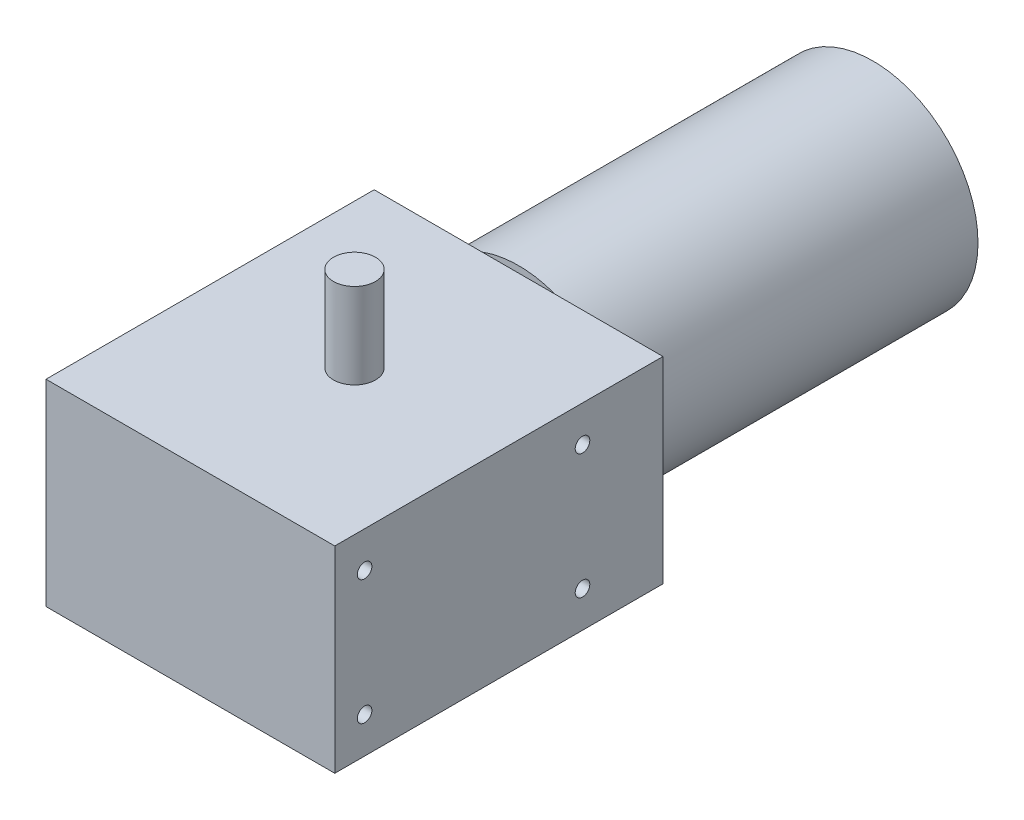
ISO-10303-21;
HEADER;
FILE_DESCRIPTION(('STEP AP214'),'2;1');
FILE_NAME('part.step','',(''),(''),'','','');
FILE_SCHEMA(('AUTOMOTIVE_DESIGN { 1 0 10303 214 1 1 1 1 }'));
ENDSEC;
DATA;
#1=APPLICATION_CONTEXT('core data for automotive mechanical design processes');
#2=APPLICATION_PROTOCOL_DEFINITION('international standard','automotive_design',2000,#1);
#3=PRODUCT_CONTEXT('',#1,'mechanical');
#4=PRODUCT('Part','Part','',(#3));
#5=PRODUCT_RELATED_PRODUCT_CATEGORY('part','',(#4));
#6=PRODUCT_DEFINITION_FORMATION('','',#4);
#7=PRODUCT_DEFINITION_CONTEXT('part definition',#1,'design');
#8=PRODUCT_DEFINITION('design','',#6,#7);
#9=PRODUCT_DEFINITION_SHAPE('','',#8);
#10=(LENGTH_UNIT() NAMED_UNIT(*) SI_UNIT(.MILLI.,.METRE.));
#11=(NAMED_UNIT(*) PLANE_ANGLE_UNIT() SI_UNIT($,.RADIAN.));
#12=(NAMED_UNIT(*) SI_UNIT($,.STERADIAN.) SOLID_ANGLE_UNIT());
#13=UNCERTAINTY_MEASURE_WITH_UNIT(LENGTH_MEASURE(1.E-05),#10,'distance_accuracy_value','');
#14=(GEOMETRIC_REPRESENTATION_CONTEXT(3) GLOBAL_UNCERTAINTY_ASSIGNED_CONTEXT((#13)) GLOBAL_UNIT_ASSIGNED_CONTEXT((#10,
#11,#12)) REPRESENTATION_CONTEXT('',''));
#15=CARTESIAN_POINT('',(0.,0.,0.));
#16=DIRECTION('',(0.,0.,1.));
#17=DIRECTION('',(1.,0.,0.));
#18=AXIS2_PLACEMENT_3D('',#15,#16,#17);
#19=CARTESIAN_POINT('',(0.,0.,-125.));
#20=DIRECTION('',(0.,0.,-1.));
#21=DIRECTION('',(-1.,0.,0.));
#22=AXIS2_PLACEMENT_3D('',#19,#20,#21);
#23=PLANE('',#22);
#24=CARTESIAN_POINT('',(0.,0.,-125.));
#25=DIRECTION('',(0.,0.,-1.));
#26=DIRECTION('',(-1.,0.,0.));
#27=AXIS2_PLACEMENT_3D('',#24,#25,#26);
#28=CIRCLE('',#27,80.);
#29=CARTESIAN_POINT('',(27.8388218141501,75.,-125.));
#30=VERTEX_POINT('',#29);
#31=CARTESIAN_POINT('',(27.8388218141501,-75.,-125.));
#32=VERTEX_POINT('',#31);
#33=EDGE_CURVE('E11',#30,#32,#28,.T.);
#34=ORIENTED_EDGE('',*,*,#33,.F.);
#35=DIRECTION('',(-1.,0.,0.));
#36=VECTOR('',#35,1.);
#37=CARTESIAN_POINT('',(-110.,75.,-125.));
#38=LINE('',#37,#36);
#39=CARTESIAN_POINT('',(110.,75.,-125.));
#40=VERTEX_POINT('',#39);
#41=EDGE_CURVE('E99',#40,#30,#38,.T.);
#42=ORIENTED_EDGE('',*,*,#41,.F.);
#43=DIRECTION('',(0.,1.,0.));
#44=VECTOR('',#43,1.);
#45=CARTESIAN_POINT('',(110.,-75.,-125.));
#46=LINE('',#45,#44);
#47=CARTESIAN_POINT('',(110.,-75.,-125.));
#48=VERTEX_POINT('',#47);
#49=EDGE_CURVE('E113',#48,#40,#46,.T.);
#50=ORIENTED_EDGE('',*,*,#49,.F.);
#51=DIRECTION('',(1.,0.,0.));
#52=VECTOR('',#51,1.);
#53=CARTESIAN_POINT('',(-110.,-75.,-125.));
#54=LINE('',#53,#52);
#55=EDGE_CURVE('E61',#32,#48,#54,.T.);
#56=ORIENTED_EDGE('',*,*,#55,.F.);
#57=EDGE_LOOP('',(#34,#42,#50,#56));
#58=FACE_BOUND('',#57,.T.);
#59=ADVANCED_FACE('F39',(#58),#23,.T.);
#60=CARTESIAN_POINT('',(110.,-75.,125.));
#61=DIRECTION('',(-1.,0.,0.));
#62=DIRECTION('',(0.,0.,1.));
#63=AXIS2_PLACEMENT_3D('',#60,#61,#62);
#64=PLANE('',#63);
#65=CARTESIAN_POINT('',(110.,-47.5,102.3));
#66=DIRECTION('',(1.,0.,0.));
#67=DIRECTION('',(0.,0.,-1.));
#68=AXIS2_PLACEMENT_3D('',#65,#66,#67);
#69=CIRCLE('',#68,5.55625);
#70=CARTESIAN_POINT('',(110.,-47.5,96.74375));
#71=VERTEX_POINT('',#70);
#72=EDGE_CURVE('E143',#71,#71,#69,.T.);
#73=ORIENTED_EDGE('',*,*,#72,.F.);
#74=EDGE_LOOP('',(#73));
#75=FACE_BOUND('',#74,.T.);
#76=CARTESIAN_POINT('',(110.,47.5,-63.7));
#77=DIRECTION('',(1.,0.,0.));
#78=DIRECTION('',(0.,0.,-1.));
#79=AXIS2_PLACEMENT_3D('',#76,#77,#78);
#80=CIRCLE('',#79,5.55625);
#81=CARTESIAN_POINT('',(110.,47.5,-69.25625));
#82=VERTEX_POINT('',#81);
#83=EDGE_CURVE('E134',#82,#82,#80,.T.);
#84=ORIENTED_EDGE('',*,*,#83,.F.);
#85=EDGE_LOOP('',(#84));
#86=FACE_BOUND('',#85,.T.);
#87=CARTESIAN_POINT('',(110.,-47.5,-63.7));
#88=DIRECTION('',(1.,0.,0.));
#89=DIRECTION('',(0.,0.,-1.));
#90=AXIS2_PLACEMENT_3D('',#87,#88,#89);
#91=CIRCLE('',#90,5.55625);
#92=CARTESIAN_POINT('',(110.,-47.5,-69.25625));
#93=VERTEX_POINT('',#92);
#94=EDGE_CURVE('E127',#93,#93,#91,.T.);
#95=ORIENTED_EDGE('',*,*,#94,.F.);
#96=EDGE_LOOP('',(#95));
#97=FACE_BOUND('',#96,.T.);
#98=CARTESIAN_POINT('',(110.,47.5,102.3));
#99=DIRECTION('',(1.,0.,0.));
#100=DIRECTION('',(0.,0.,-1.));
#101=AXIS2_PLACEMENT_3D('',#98,#99,#100);
#102=CIRCLE('',#101,5.55625);
#103=CARTESIAN_POINT('',(110.,47.5,96.74375));
#104=VERTEX_POINT('',#103);
#105=EDGE_CURVE('E142',#104,#104,#102,.T.);
#106=ORIENTED_EDGE('',*,*,#105,.F.);
#107=EDGE_LOOP('',(#106));
#108=FACE_BOUND('',#107,.T.);
#109=ORIENTED_EDGE('',*,*,#49,.T.);
#110=DIRECTION('',(0.,0.,-1.));
#111=VECTOR('',#110,1.);
#112=CARTESIAN_POINT('',(110.,75.,125.));
#113=LINE('',#112,#111);
#114=CARTESIAN_POINT('',(110.,75.,125.));
#115=VERTEX_POINT('',#114);
#116=EDGE_CURVE('E205',#115,#40,#113,.T.);
#117=ORIENTED_EDGE('',*,*,#116,.F.);
#118=DIRECTION('',(0.,1.,0.));
#119=VECTOR('',#118,1.);
#120=CARTESIAN_POINT('',(110.,-75.,125.));
#121=LINE('',#120,#119);
#122=CARTESIAN_POINT('',(110.,-75.,125.));
#123=VERTEX_POINT('',#122);
#124=EDGE_CURVE('E172',#123,#115,#121,.T.);
#125=ORIENTED_EDGE('',*,*,#124,.F.);
#126=DIRECTION('',(0.,0.,-1.));
#127=VECTOR('',#126,1.);
#128=CARTESIAN_POINT('',(110.,-75.,125.));
#129=LINE('',#128,#127);
#130=EDGE_CURVE('E186',#123,#48,#129,.T.);
#131=ORIENTED_EDGE('',*,*,#130,.T.);
#132=EDGE_LOOP('',(#109,#117,#125,#131));
#133=FACE_BOUND('',#132,.T.);
#134=ADVANCED_FACE('F41',(#75,#86,#97,#108,#133),#64,.F.);
#135=CARTESIAN_POINT('',(-110.,75.,125.));
#136=DIRECTION('',(0.,-1.,0.));
#137=DIRECTION('',(0.,0.,-1.));
#138=AXIS2_PLACEMENT_3D('',#135,#136,#137);
#139=PLANE('',#138);
#140=CARTESIAN_POINT('',(0.,75.,0.));
#141=DIRECTION('',(0.,-1.,0.));
#142=DIRECTION('',(0.,0.,-1.));
#143=AXIS2_PLACEMENT_3D('',#140,#141,#142);
#144=CIRCLE('',#143,16.);
#145=CARTESIAN_POINT('',(0.,75.,-16.));
#146=VERTEX_POINT('',#145);
#147=EDGE_CURVE('E120',#146,#146,#144,.F.);
#148=ORIENTED_EDGE('',*,*,#147,.F.);
#149=EDGE_LOOP('',(#148));
#150=FACE_BOUND('',#149,.T.);
#151=ORIENTED_EDGE('',*,*,#41,.T.);
#152=CARTESIAN_POINT('',(-27.8388218141501,75.,-125.));
#153=VERTEX_POINT('',#152);
#154=EDGE_CURVE('E92',#30,#153,#38,.T.);
#155=ORIENTED_EDGE('',*,*,#154,.T.);
#156=CARTESIAN_POINT('',(-110.,75.,-125.));
#157=VERTEX_POINT('',#156);
#158=EDGE_CURVE('E96',#153,#157,#38,.T.);
#159=ORIENTED_EDGE('',*,*,#158,.T.);
#160=DIRECTION('',(0.,0.,-1.));
#161=VECTOR('',#160,1.);
#162=CARTESIAN_POINT('',(-110.,75.,125.));
#163=LINE('',#162,#161);
#164=CARTESIAN_POINT('',(-110.,75.,125.));
#165=VERTEX_POINT('',#164);
#166=EDGE_CURVE('E203',#165,#157,#163,.T.);
#167=ORIENTED_EDGE('',*,*,#166,.F.);
#168=DIRECTION('',(-1.,0.,0.));
#169=VECTOR('',#168,1.);
#170=CARTESIAN_POINT('',(-110.,75.,125.));
#171=LINE('',#170,#169);
#172=EDGE_CURVE('E176',#115,#165,#171,.T.);
#173=ORIENTED_EDGE('',*,*,#172,.F.);
#174=ORIENTED_EDGE('',*,*,#116,.T.);
#175=EDGE_LOOP('',(#151,#155,#159,#167,#173,#174));
#176=FACE_BOUND('',#175,.T.);
#177=ADVANCED_FACE('F94',(#150,#176),#139,.F.);
#178=CARTESIAN_POINT('',(-110.,-75.,125.));
#179=DIRECTION('',(1.,0.,0.));
#180=DIRECTION('',(0.,0.,-1.));
#181=AXIS2_PLACEMENT_3D('',#178,#179,#180);
#182=PLANE('',#181);
#183=DIRECTION('',(0.,-1.,0.));
#184=VECTOR('',#183,1.);
#185=CARTESIAN_POINT('',(-110.,-75.,-125.));
#186=LINE('',#185,#184);
#187=CARTESIAN_POINT('',(-110.,-75.,-125.));
#188=VERTEX_POINT('',#187);
#189=EDGE_CURVE('E111',#157,#188,#186,.T.);
#190=ORIENTED_EDGE('',*,*,#189,.T.);
#191=DIRECTION('',(0.,0.,-1.));
#192=VECTOR('',#191,1.);
#193=CARTESIAN_POINT('',(-110.,-75.,125.));
#194=LINE('',#193,#192);
#195=CARTESIAN_POINT('',(-110.,-75.,125.));
#196=VERTEX_POINT('',#195);
#197=EDGE_CURVE('E199',#196,#188,#194,.T.);
#198=ORIENTED_EDGE('',*,*,#197,.F.);
#199=DIRECTION('',(0.,-1.,0.));
#200=VECTOR('',#199,1.);
#201=CARTESIAN_POINT('',(-110.,-75.,125.));
#202=LINE('',#201,#200);
#203=EDGE_CURVE('E180',#165,#196,#202,.T.);
#204=ORIENTED_EDGE('',*,*,#203,.F.);
#205=ORIENTED_EDGE('',*,*,#166,.T.);
#206=EDGE_LOOP('',(#190,#198,#204,#205));
#207=FACE_BOUND('',#206,.T.);
#208=ADVANCED_FACE('F218',(#207),#182,.F.);
#209=CARTESIAN_POINT('',(-110.,-75.,125.));
#210=DIRECTION('',(0.,1.,0.));
#211=DIRECTION('',(0.,0.,1.));
#212=AXIS2_PLACEMENT_3D('',#209,#210,#211);
#213=PLANE('',#212);
#214=CARTESIAN_POINT('',(0.,-75.,0.));
#215=DIRECTION('',(0.,1.,0.));
#216=DIRECTION('',(0.,0.,1.));
#217=AXIS2_PLACEMENT_3D('',#214,#215,#216);
#218=CIRCLE('',#217,16.);
#219=CARTESIAN_POINT('',(0.,-75.,16.));
#220=VERTEX_POINT('',#219);
#221=EDGE_CURVE('E43',#220,#220,#218,.F.);
#222=ORIENTED_EDGE('',*,*,#221,.F.);
#223=EDGE_LOOP('',(#222));
#224=FACE_BOUND('',#223,.T.);
#225=CARTESIAN_POINT('',(-27.8388218141501,-75.,-125.));
#226=VERTEX_POINT('',#225);
#227=EDGE_CURVE('E177',#188,#226,#54,.T.);
#228=ORIENTED_EDGE('',*,*,#227,.T.);
#229=EDGE_CURVE('E195',#226,#32,#54,.T.);
#230=ORIENTED_EDGE('',*,*,#229,.T.);
#231=ORIENTED_EDGE('',*,*,#55,.T.);
#232=ORIENTED_EDGE('',*,*,#130,.F.);
#233=DIRECTION('',(1.,0.,0.));
#234=VECTOR('',#233,1.);
#235=CARTESIAN_POINT('',(-110.,-75.,125.));
#236=LINE('',#235,#234);
#237=EDGE_CURVE('E183',#196,#123,#236,.T.);
#238=ORIENTED_EDGE('',*,*,#237,.F.);
#239=ORIENTED_EDGE('',*,*,#197,.T.);
#240=EDGE_LOOP('',(#228,#230,#231,#232,#238,#239));
#241=FACE_BOUND('',#240,.T.);
#242=ADVANCED_FACE('F214',(#224,#241),#213,.F.);
#243=CARTESIAN_POINT('',(0.,0.,125.));
#244=DIRECTION('',(0.,0.,-1.));
#245=DIRECTION('',(-1.,0.,0.));
#246=AXIS2_PLACEMENT_3D('',#243,#244,#245);
#247=PLANE('',#246);
#248=ORIENTED_EDGE('',*,*,#124,.T.);
#249=ORIENTED_EDGE('',*,*,#172,.T.);
#250=ORIENTED_EDGE('',*,*,#203,.T.);
#251=ORIENTED_EDGE('',*,*,#237,.T.);
#252=EDGE_LOOP('',(#248,#249,#250,#251));
#253=FACE_BOUND('',#252,.T.);
#254=ADVANCED_FACE('F217',(#253),#247,.F.);
#255=EDGE_CURVE('E49',#226,#153,#28,.T.);
#256=ORIENTED_EDGE('',*,*,#255,.F.);
#257=ORIENTED_EDGE('',*,*,#227,.F.);
#258=ORIENTED_EDGE('',*,*,#189,.F.);
#259=ORIENTED_EDGE('',*,*,#158,.F.);
#260=EDGE_LOOP('',(#256,#257,#258,#259));
#261=FACE_BOUND('',#260,.T.);
#262=ADVANCED_FACE('F108',(#261),#23,.T.);
#263=CARTESIAN_POINT('',(0.,-140.,0.));
#264=DIRECTION('',(0.,1.,0.));
#265=DIRECTION('',(0.,0.,1.));
#266=AXIS2_PLACEMENT_3D('',#263,#264,#265);
#267=PLANE('',#266);
#268=CARTESIAN_POINT('',(0.,-140.,0.));
#269=DIRECTION('',(0.,1.,0.));
#270=DIRECTION('',(0.,0.,1.));
#271=AXIS2_PLACEMENT_3D('',#268,#269,#270);
#272=CIRCLE('',#271,16.);
#273=CARTESIAN_POINT('',(0.,-140.,16.));
#274=VERTEX_POINT('',#273);
#275=EDGE_CURVE('E158',#274,#274,#272,.T.);
#276=ORIENTED_EDGE('',*,*,#275,.F.);
#277=EDGE_LOOP('',(#276));
#278=FACE_BOUND('',#277,.T.);
#279=ADVANCED_FACE('F238',(#278),#267,.F.);
#280=CARTESIAN_POINT('',(0.,140.,0.));
#281=DIRECTION('',(0.,-1.,0.));
#282=DIRECTION('',(0.,0.,-1.));
#283=AXIS2_PLACEMENT_3D('',#280,#281,#282);
#284=CYLINDRICAL_SURFACE('',#283,16.);
#285=ORIENTED_EDGE('',*,*,#275,.T.);
#286=EDGE_LOOP('',(#285));
#287=FACE_BOUND('',#286,.T.);
#288=ORIENTED_EDGE('',*,*,#221,.T.);
#289=EDGE_LOOP('',(#288));
#290=FACE_BOUND('',#289,.T.);
#291=ADVANCED_FACE('F212',(#287,#290),#284,.T.);
#292=CARTESIAN_POINT('',(0.,140.,0.));
#293=DIRECTION('',(0.,1.,0.));
#294=DIRECTION('',(0.,0.,1.));
#295=AXIS2_PLACEMENT_3D('',#292,#293,#294);
#296=CIRCLE('',#295,16.);
#297=CARTESIAN_POINT('',(0.,140.,16.));
#298=VERTEX_POINT('',#297);
#299=EDGE_CURVE('E162',#298,#298,#296,.T.);
#300=ORIENTED_EDGE('',*,*,#299,.F.);
#301=EDGE_LOOP('',(#300));
#302=FACE_BOUND('',#301,.T.);
#303=ORIENTED_EDGE('',*,*,#147,.T.);
#304=EDGE_LOOP('',(#303));
#305=FACE_BOUND('',#304,.T.);
#306=ADVANCED_FACE('F249',(#302,#305),#284,.T.);
#307=CARTESIAN_POINT('',(0.,140.,0.));
#308=DIRECTION('',(0.,1.,0.));
#309=DIRECTION('',(0.,0.,1.));
#310=AXIS2_PLACEMENT_3D('',#307,#308,#309);
#311=PLANE('',#310);
#312=ORIENTED_EDGE('',*,*,#299,.T.);
#313=EDGE_LOOP('',(#312));
#314=FACE_BOUND('',#313,.T.);
#315=ADVANCED_FACE('F251',(#314),#311,.T.);
#316=CARTESIAN_POINT('',(-89.9999999999999,47.5,102.3));
#317=DIRECTION('',(1.,0.,0.));
#318=DIRECTION('',(0.,0.,-1.));
#319=AXIS2_PLACEMENT_3D('',#316,#317,#318);
#320=CYLINDRICAL_SURFACE('',#319,5.55625);
#321=CARTESIAN_POINT('',(-89.9999999999999,47.5,102.3));
#322=DIRECTION('',(1.,0.,0.));
#323=DIRECTION('',(0.,0.,-1.));
#324=AXIS2_PLACEMENT_3D('',#321,#322,#323);
#325=CIRCLE('',#324,5.55625);
#326=CARTESIAN_POINT('',(-89.9999999999999,47.5,96.74375));
#327=VERTEX_POINT('',#326);
#328=EDGE_CURVE('E154',#327,#327,#325,.T.);
#329=ORIENTED_EDGE('',*,*,#328,.F.);
#330=EDGE_LOOP('',(#329));
#331=FACE_BOUND('',#330,.T.);
#332=ORIENTED_EDGE('',*,*,#105,.T.);
#333=EDGE_LOOP('',(#332));
#334=FACE_BOUND('',#333,.T.);
#335=ADVANCED_FACE('F256',(#331,#334),#320,.F.);
#336=CARTESIAN_POINT('',(-89.9999999999999,47.5,102.3));
#337=DIRECTION('',(1.,0.,0.));
#338=DIRECTION('',(0.,0.,-1.));
#339=AXIS2_PLACEMENT_3D('',#336,#337,#338);
#340=PLANE('',#339);
#341=ORIENTED_EDGE('',*,*,#328,.T.);
#342=EDGE_LOOP('',(#341));
#343=FACE_BOUND('',#342,.T.);
#344=ADVANCED_FACE('F260',(#343),#340,.T.);
#345=CARTESIAN_POINT('',(-89.9999999999999,-47.5,-63.7));
#346=DIRECTION('',(1.,0.,0.));
#347=DIRECTION('',(0.,0.,-1.));
#348=AXIS2_PLACEMENT_3D('',#345,#346,#347);
#349=CYLINDRICAL_SURFACE('',#348,5.55625);
#350=CARTESIAN_POINT('',(-89.9999999999999,-47.5,-63.7));
#351=DIRECTION('',(1.,0.,0.));
#352=DIRECTION('',(0.,0.,-1.));
#353=AXIS2_PLACEMENT_3D('',#350,#351,#352);
#354=CIRCLE('',#353,5.55625);
#355=CARTESIAN_POINT('',(-89.9999999999999,-47.5,-69.25625));
#356=VERTEX_POINT('',#355);
#357=EDGE_CURVE('E130',#356,#356,#354,.T.);
#358=ORIENTED_EDGE('',*,*,#357,.F.);
#359=EDGE_LOOP('',(#358));
#360=FACE_BOUND('',#359,.T.);
#361=ORIENTED_EDGE('',*,*,#94,.T.);
#362=EDGE_LOOP('',(#361));
#363=FACE_BOUND('',#362,.T.);
#364=ADVANCED_FACE('F264',(#360,#363),#349,.F.);
#365=CARTESIAN_POINT('',(-89.9999999999999,-47.5,-63.7));
#366=DIRECTION('',(1.,0.,0.));
#367=DIRECTION('',(0.,0.,-1.));
#368=AXIS2_PLACEMENT_3D('',#365,#366,#367);
#369=PLANE('',#368);
#370=ORIENTED_EDGE('',*,*,#357,.T.);
#371=EDGE_LOOP('',(#370));
#372=FACE_BOUND('',#371,.T.);
#373=ADVANCED_FACE('F270',(#372),#369,.T.);
#374=CARTESIAN_POINT('',(-89.9999999999999,47.5,-63.7));
#375=DIRECTION('',(1.,0.,0.));
#376=DIRECTION('',(0.,0.,-1.));
#377=AXIS2_PLACEMENT_3D('',#374,#375,#376);
#378=CYLINDRICAL_SURFACE('',#377,5.55625);
#379=CARTESIAN_POINT('',(-89.9999999999999,47.5,-63.7));
#380=DIRECTION('',(1.,0.,0.));
#381=DIRECTION('',(0.,0.,-1.));
#382=AXIS2_PLACEMENT_3D('',#379,#380,#381);
#383=CIRCLE('',#382,5.55625);
#384=CARTESIAN_POINT('',(-89.9999999999999,47.5,-69.25625));
#385=VERTEX_POINT('',#384);
#386=EDGE_CURVE('E147',#385,#385,#383,.T.);
#387=ORIENTED_EDGE('',*,*,#386,.F.);
#388=EDGE_LOOP('',(#387));
#389=FACE_BOUND('',#388,.T.);
#390=ORIENTED_EDGE('',*,*,#83,.T.);
#391=EDGE_LOOP('',(#390));
#392=FACE_BOUND('',#391,.T.);
#393=ADVANCED_FACE('F266',(#389,#392),#378,.F.);
#394=CARTESIAN_POINT('',(-89.9999999999999,47.5,-63.7));
#395=DIRECTION('',(1.,0.,0.));
#396=DIRECTION('',(0.,0.,-1.));
#397=AXIS2_PLACEMENT_3D('',#394,#395,#396);
#398=PLANE('',#397);
#399=ORIENTED_EDGE('',*,*,#386,.T.);
#400=EDGE_LOOP('',(#399));
#401=FACE_BOUND('',#400,.T.);
#402=ADVANCED_FACE('F269',(#401),#398,.T.);
#403=CARTESIAN_POINT('',(-89.9999999999999,-47.5,102.3));
#404=DIRECTION('',(1.,0.,0.));
#405=DIRECTION('',(0.,0.,-1.));
#406=AXIS2_PLACEMENT_3D('',#403,#404,#405);
#407=CYLINDRICAL_SURFACE('',#406,5.55625);
#408=CARTESIAN_POINT('',(-89.9999999999999,-47.5,102.3));
#409=DIRECTION('',(1.,0.,0.));
#410=DIRECTION('',(0.,0.,-1.));
#411=AXIS2_PLACEMENT_3D('',#408,#409,#410);
#412=CIRCLE('',#411,5.55625);
#413=CARTESIAN_POINT('',(-89.9999999999999,-47.5,96.74375));
#414=VERTEX_POINT('',#413);
#415=EDGE_CURVE('E138',#414,#414,#412,.T.);
#416=ORIENTED_EDGE('',*,*,#415,.F.);
#417=EDGE_LOOP('',(#416));
#418=FACE_BOUND('',#417,.T.);
#419=ORIENTED_EDGE('',*,*,#72,.T.);
#420=EDGE_LOOP('',(#419));
#421=FACE_BOUND('',#420,.T.);
#422=ADVANCED_FACE('F274',(#418,#421),#407,.F.);
#423=CARTESIAN_POINT('',(-89.9999999999999,-47.5,102.3));
#424=DIRECTION('',(1.,0.,0.));
#425=DIRECTION('',(0.,0.,-1.));
#426=AXIS2_PLACEMENT_3D('',#423,#424,#425);
#427=PLANE('',#426);
#428=ORIENTED_EDGE('',*,*,#415,.T.);
#429=EDGE_LOOP('',(#428));
#430=FACE_BOUND('',#429,.T.);
#431=ADVANCED_FACE('F278',(#430),#427,.T.);
#432=CARTESIAN_POINT('',(0.,0.,-125.));
#433=DIRECTION('',(0.,0.,-1.));
#434=DIRECTION('',(-1.,0.,0.));
#435=AXIS2_PLACEMENT_3D('',#432,#433,#434);
#436=PLANE('',#435);
#437=ORIENTED_EDGE('',*,*,#229,.F.);
#438=EDGE_CURVE('E51',#32,#226,#28,.T.);
#439=ORIENTED_EDGE('',*,*,#438,.F.);
#440=EDGE_LOOP('',(#437,#439));
#441=FACE_BOUND('',#440,.T.);
#442=ADVANCED_FACE('F224',(#441),#436,.F.);
#443=CARTESIAN_POINT('',(0.,0.,-395.));
#444=DIRECTION('',(0.,0.,1.));
#445=DIRECTION('',(1.,0.,0.));
#446=AXIS2_PLACEMENT_3D('',#443,#444,#445);
#447=CYLINDRICAL_SURFACE('',#446,80.);
#448=CARTESIAN_POINT('',(0.,0.,-395.));
#449=DIRECTION('',(0.,0.,-1.));
#450=DIRECTION('',(-1.,0.,0.));
#451=AXIS2_PLACEMENT_3D('',#448,#449,#450);
#452=CIRCLE('',#451,80.);
#453=CARTESIAN_POINT('',(-80.,0.,-395.));
#454=VERTEX_POINT('',#453);
#455=EDGE_CURVE('E123',#454,#454,#452,.T.);
#456=ORIENTED_EDGE('',*,*,#455,.F.);
#457=EDGE_LOOP('',(#456));
#458=FACE_BOUND('',#457,.T.);
#459=EDGE_CURVE('E117',#153,#30,#28,.T.);
#460=ORIENTED_EDGE('',*,*,#459,.T.);
#461=ORIENTED_EDGE('',*,*,#33,.T.);
#462=ORIENTED_EDGE('',*,*,#438,.T.);
#463=ORIENTED_EDGE('',*,*,#255,.T.);
#464=EDGE_LOOP('',(#460,#461,#462,#463));
#465=FACE_BOUND('',#464,.T.);
#466=ADVANCED_FACE('F116',(#458,#465),#447,.T.);
#467=CARTESIAN_POINT('',(0.,0.,-395.));
#468=DIRECTION('',(0.,0.,-1.));
#469=DIRECTION('',(-1.,0.,0.));
#470=AXIS2_PLACEMENT_3D('',#467,#468,#469);
#471=PLANE('',#470);
#472=ORIENTED_EDGE('',*,*,#455,.T.);
#473=EDGE_LOOP('',(#472));
#474=FACE_BOUND('',#473,.T.);
#475=ADVANCED_FACE('F291',(#474),#471,.T.);
#476=ORIENTED_EDGE('',*,*,#154,.F.);
#477=ORIENTED_EDGE('',*,*,#459,.F.);
#478=EDGE_LOOP('',(#476,#477));
#479=FACE_BOUND('',#478,.T.);
#480=ADVANCED_FACE('F121',(#479),#436,.F.);
#481=CLOSED_SHELL('',(#59,#134,#177,#208,#242,#254,#262,#279,#291,#306,#315,#335,#344,#364,#373,
#393,#402,#422,#431,#442,#466,#475,#480));
#482=MANIFOLD_SOLID_BREP('B2',#481);
#483=ADVANCED_BREP_SHAPE_REPRESENTATION('',(#18,#482),#14);
#484=SHAPE_DEFINITION_REPRESENTATION(#9,#483);
ENDSEC;
END-ISO-10303-21;
